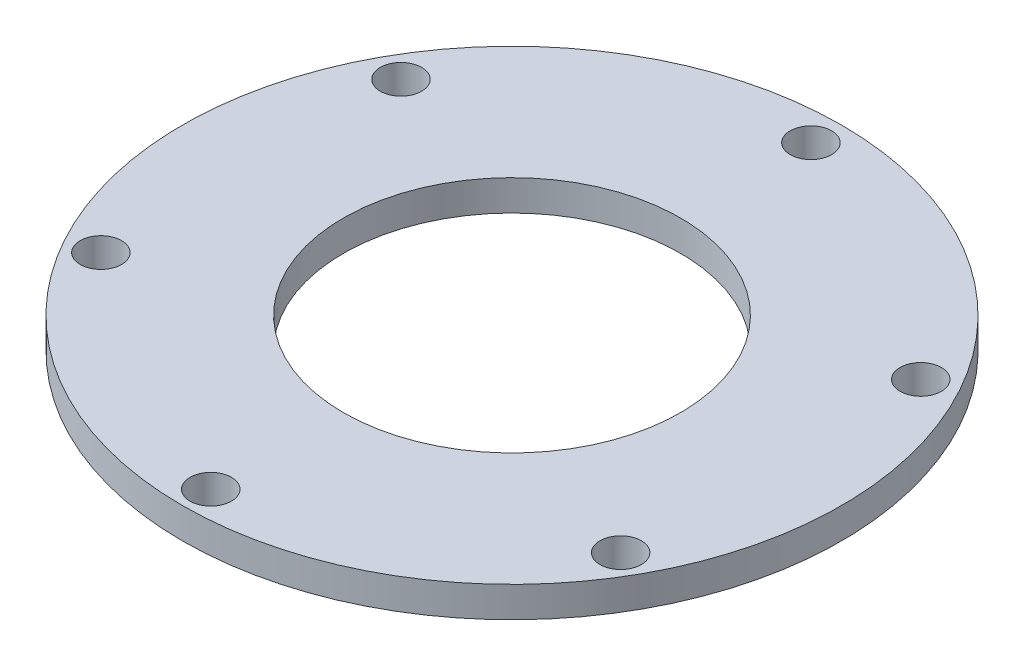
ISO-10303-21;
HEADER;
FILE_DESCRIPTION(('STEP AP214'),'2;1');
FILE_NAME('part.step','',(''),(''),'','','');
FILE_SCHEMA(('AUTOMOTIVE_DESIGN { 1 0 10303 214 1 1 1 1 }'));
ENDSEC;
DATA;
#1=APPLICATION_CONTEXT('core data for automotive mechanical design processes');
#2=APPLICATION_PROTOCOL_DEFINITION('international standard','automotive_design',2000,#1);
#3=PRODUCT_CONTEXT('',#1,'mechanical');
#4=PRODUCT('Part','Part','',(#3));
#5=PRODUCT_RELATED_PRODUCT_CATEGORY('part','',(#4));
#6=PRODUCT_DEFINITION_FORMATION('','',#4);
#7=PRODUCT_DEFINITION_CONTEXT('part definition',#1,'design');
#8=PRODUCT_DEFINITION('design','',#6,#7);
#9=PRODUCT_DEFINITION_SHAPE('','',#8);
#10=(LENGTH_UNIT() NAMED_UNIT(*) SI_UNIT(.MILLI.,.METRE.));
#11=(NAMED_UNIT(*) PLANE_ANGLE_UNIT() SI_UNIT($,.RADIAN.));
#12=(NAMED_UNIT(*) SI_UNIT($,.STERADIAN.) SOLID_ANGLE_UNIT());
#13=UNCERTAINTY_MEASURE_WITH_UNIT(LENGTH_MEASURE(1.E-05),#10,'distance_accuracy_value','');
#14=(GEOMETRIC_REPRESENTATION_CONTEXT(3) GLOBAL_UNCERTAINTY_ASSIGNED_CONTEXT((#13)) GLOBAL_UNIT_ASSIGNED_CONTEXT((#10,
#11,#12)) REPRESENTATION_CONTEXT('',''));
#15=CARTESIAN_POINT('',(0.,0.,0.));
#16=DIRECTION('',(0.,0.,1.));
#17=DIRECTION('',(1.,0.,0.));
#18=AXIS2_PLACEMENT_3D('',#15,#16,#17);
#19=CARTESIAN_POINT('',(0.,10.,0.));
#20=DIRECTION('',(0.,-1.,0.));
#21=DIRECTION('',(0.,0.,-1.));
#22=AXIS2_PLACEMENT_3D('',#19,#20,#21);
#23=CYLINDRICAL_SURFACE('',#22,107.5);
#24=CARTESIAN_POINT('',(0.,10.,0.));
#25=DIRECTION('',(0.,1.,0.));
#26=DIRECTION('',(0.,0.,1.));
#27=AXIS2_PLACEMENT_3D('',#24,#25,#26);
#28=CIRCLE('',#27,107.5);
#29=CARTESIAN_POINT('',(0.,10.,107.5));
#30=VERTEX_POINT('',#29);
#31=EDGE_CURVE('E10',#30,#30,#28,.T.);
#32=ORIENTED_EDGE('',*,*,#31,.F.);
#33=EDGE_LOOP('',(#32));
#34=FACE_BOUND('',#33,.T.);
#35=CARTESIAN_POINT('',(0.,0.,0.));
#36=DIRECTION('',(0.,1.,0.));
#37=DIRECTION('',(0.,0.,1.));
#38=AXIS2_PLACEMENT_3D('',#35,#36,#37);
#39=CIRCLE('',#38,107.5);
#40=CARTESIAN_POINT('',(0.,0.,107.5));
#41=VERTEX_POINT('',#40);
#42=EDGE_CURVE('E38',#41,#41,#39,.T.);
#43=ORIENTED_EDGE('',*,*,#42,.T.);
#44=EDGE_LOOP('',(#43));
#45=FACE_BOUND('',#44,.T.);
#46=ADVANCED_FACE('F31',(#34,#45),#23,.T.);
#47=CARTESIAN_POINT('',(0.,10.,0.));
#48=DIRECTION('',(0.,1.,0.));
#49=DIRECTION('',(0.,0.,1.));
#50=AXIS2_PLACEMENT_3D('',#47,#48,#49);
#51=PLANE('',#50);
#52=CARTESIAN_POINT('',(0.,10.,0.));
#53=DIRECTION('',(0.,1.,0.));
#54=DIRECTION('',(0.,0.,1.));
#55=AXIS2_PLACEMENT_3D('',#52,#53,#54);
#56=CIRCLE('',#55,55.);
#57=CARTESIAN_POINT('',(0.,10.,55.));
#58=VERTEX_POINT('',#57);
#59=EDGE_CURVE('E84',#58,#58,#56,.T.);
#60=ORIENTED_EDGE('',*,*,#59,.F.);
#61=EDGE_LOOP('',(#60));
#62=FACE_BOUND('',#61,.T.);
#63=CARTESIAN_POINT('',(84.7717038680075,10.,-48.5570339521433));
#64=DIRECTION('',(0.,1.,0.));
#65=DIRECTION('',(0.,0.,1.));
#66=AXIS2_PLACEMENT_3D('',#63,#64,#65);
#67=CIRCLE('',#66,6.74999999999999);
#68=CARTESIAN_POINT('',(84.7717038680075,10.,-41.8070339521433));
#69=VERTEX_POINT('',#68);
#70=EDGE_CURVE('E80',#69,#69,#67,.T.);
#71=ORIENTED_EDGE('',*,*,#70,.F.);
#72=EDGE_LOOP('',(#71));
#73=FACE_BOUND('',#72,.T.);
#74=CARTESIAN_POINT('',(84.7717038680085,10.,49.3288981435723));
#75=DIRECTION('',(0.,1.,0.));
#76=DIRECTION('',(0.,0.,1.));
#77=AXIS2_PLACEMENT_3D('',#74,#75,#76);
#78=CIRCLE('',#77,6.74999999999999);
#79=CARTESIAN_POINT('',(84.7717038680085,10.,56.0788981435723));
#80=VERTEX_POINT('',#79);
#81=EDGE_CURVE('E74',#80,#80,#78,.T.);
#82=ORIENTED_EDGE('',*,*,#81,.F.);
#83=EDGE_LOOP('',(#82));
#84=FACE_BOUND('',#83,.T.);
#85=CARTESIAN_POINT('',(0.,10.,98.2718641914308));
#86=DIRECTION('',(0.,1.,0.));
#87=DIRECTION('',(0.,0.,1.));
#88=AXIS2_PLACEMENT_3D('',#85,#86,#87);
#89=CIRCLE('',#88,6.74999999999999);
#90=CARTESIAN_POINT('',(0.,10.,105.021864191431));
#91=VERTEX_POINT('',#90);
#92=EDGE_CURVE('E71',#91,#91,#89,.T.);
#93=ORIENTED_EDGE('',*,*,#92,.F.);
#94=EDGE_LOOP('',(#93));
#95=FACE_BOUND('',#94,.T.);
#96=CARTESIAN_POINT('',(-84.7717038680079,10.,49.3288981435735));
#97=DIRECTION('',(0.,1.,0.));
#98=DIRECTION('',(0.,0.,1.));
#99=AXIS2_PLACEMENT_3D('',#96,#97,#98);
#100=CIRCLE('',#99,6.74999999999999);
#101=CARTESIAN_POINT('',(-84.7717038680079,10.,56.0788981435735));
#102=VERTEX_POINT('',#101);
#103=EDGE_CURVE('E65',#102,#102,#100,.T.);
#104=ORIENTED_EDGE('',*,*,#103,.F.);
#105=EDGE_LOOP('',(#104));
#106=FACE_BOUND('',#105,.T.);
#107=CARTESIAN_POINT('',(-84.7717038680082,10.,-48.5570339521421));
#108=DIRECTION('',(0.,1.,0.));
#109=DIRECTION('',(0.,0.,1.));
#110=AXIS2_PLACEMENT_3D('',#107,#108,#109);
#111=CIRCLE('',#110,6.74999999999999);
#112=CARTESIAN_POINT('',(-84.7717038680082,10.,-41.8070339521421));
#113=VERTEX_POINT('',#112);
#114=EDGE_CURVE('E56',#113,#113,#111,.T.);
#115=ORIENTED_EDGE('',*,*,#114,.F.);
#116=EDGE_LOOP('',(#115));
#117=FACE_BOUND('',#116,.T.);
#118=CARTESIAN_POINT('',(0.,10.,-97.5));
#119=DIRECTION('',(0.,1.,0.));
#120=DIRECTION('',(0.,0.,1.));
#121=AXIS2_PLACEMENT_3D('',#118,#119,#120);
#122=CIRCLE('',#121,6.74999999999999);
#123=CARTESIAN_POINT('',(0.,10.,-90.75));
#124=VERTEX_POINT('',#123);
#125=EDGE_CURVE('E46',#124,#124,#122,.T.);
#126=ORIENTED_EDGE('',*,*,#125,.F.);
#127=EDGE_LOOP('',(#126));
#128=FACE_BOUND('',#127,.T.);
#129=ORIENTED_EDGE('',*,*,#31,.T.);
#130=EDGE_LOOP('',(#129));
#131=FACE_BOUND('',#130,.T.);
#132=ADVANCED_FACE('F100',(#62,#73,#84,#95,#106,#117,#128,#131),#51,.T.);
#133=CARTESIAN_POINT('',(0.,0.,0.));
#134=DIRECTION('',(0.,1.,0.));
#135=DIRECTION('',(0.,0.,1.));
#136=AXIS2_PLACEMENT_3D('',#133,#134,#135);
#137=PLANE('',#136);
#138=CARTESIAN_POINT('',(0.,0.,0.));
#139=DIRECTION('',(0.,1.,0.));
#140=DIRECTION('',(0.,0.,1.));
#141=AXIS2_PLACEMENT_3D('',#138,#139,#140);
#142=CIRCLE('',#141,55.);
#143=CARTESIAN_POINT('',(0.,0.,55.));
#144=VERTEX_POINT('',#143);
#145=EDGE_CURVE('E83',#144,#144,#142,.T.);
#146=ORIENTED_EDGE('',*,*,#145,.T.);
#147=EDGE_LOOP('',(#146));
#148=FACE_BOUND('',#147,.T.);
#149=CARTESIAN_POINT('',(84.7717038680075,0.,-48.5570339521433));
#150=DIRECTION('',(0.,1.,0.));
#151=DIRECTION('',(0.,0.,1.));
#152=AXIS2_PLACEMENT_3D('',#149,#150,#151);
#153=CIRCLE('',#152,6.74999999999998);
#154=CARTESIAN_POINT('',(84.7717038680075,0.,-41.8070339521433));
#155=VERTEX_POINT('',#154);
#156=EDGE_CURVE('E77',#155,#155,#153,.T.);
#157=ORIENTED_EDGE('',*,*,#156,.T.);
#158=EDGE_LOOP('',(#157));
#159=FACE_BOUND('',#158,.T.);
#160=CARTESIAN_POINT('',(84.7717038680085,0.,49.3288981435723));
#161=DIRECTION('',(0.,1.,0.));
#162=DIRECTION('',(0.,0.,1.));
#163=AXIS2_PLACEMENT_3D('',#160,#161,#162);
#164=CIRCLE('',#163,6.74999999999998);
#165=CARTESIAN_POINT('',(84.7717038680085,0.,56.0788981435723));
#166=VERTEX_POINT('',#165);
#167=EDGE_CURVE('E34',#166,#166,#164,.T.);
#168=ORIENTED_EDGE('',*,*,#167,.T.);
#169=EDGE_LOOP('',(#168));
#170=FACE_BOUND('',#169,.T.);
#171=CARTESIAN_POINT('',(0.,0.,98.2718641914308));
#172=DIRECTION('',(0.,1.,0.));
#173=DIRECTION('',(0.,0.,1.));
#174=AXIS2_PLACEMENT_3D('',#171,#172,#173);
#175=CIRCLE('',#174,6.74999999999998);
#176=CARTESIAN_POINT('',(0.,0.,105.021864191431));
#177=VERTEX_POINT('',#176);
#178=EDGE_CURVE('E68',#177,#177,#175,.T.);
#179=ORIENTED_EDGE('',*,*,#178,.T.);
#180=EDGE_LOOP('',(#179));
#181=FACE_BOUND('',#180,.T.);
#182=CARTESIAN_POINT('',(-84.7717038680079,0.,49.3288981435735));
#183=DIRECTION('',(0.,1.,0.));
#184=DIRECTION('',(0.,0.,1.));
#185=AXIS2_PLACEMENT_3D('',#182,#183,#184);
#186=CIRCLE('',#185,6.74999999999998);
#187=CARTESIAN_POINT('',(-84.7717038680079,0.,56.0788981435735));
#188=VERTEX_POINT('',#187);
#189=EDGE_CURVE('E60',#188,#188,#186,.T.);
#190=ORIENTED_EDGE('',*,*,#189,.T.);
#191=EDGE_LOOP('',(#190));
#192=FACE_BOUND('',#191,.T.);
#193=CARTESIAN_POINT('',(-84.7717038680082,0.,-48.5570339521421));
#194=DIRECTION('',(0.,1.,0.));
#195=DIRECTION('',(0.,0.,1.));
#196=AXIS2_PLACEMENT_3D('',#193,#194,#195);
#197=CIRCLE('',#196,6.74999999999998);
#198=CARTESIAN_POINT('',(-84.7717038680082,0.,-41.8070339521421));
#199=VERTEX_POINT('',#198);
#200=EDGE_CURVE('E52',#199,#199,#197,.T.);
#201=ORIENTED_EDGE('',*,*,#200,.T.);
#202=EDGE_LOOP('',(#201));
#203=FACE_BOUND('',#202,.T.);
#204=CARTESIAN_POINT('',(0.,0.,-97.5));
#205=DIRECTION('',(0.,1.,0.));
#206=DIRECTION('',(0.,0.,1.));
#207=AXIS2_PLACEMENT_3D('',#204,#205,#206);
#208=CIRCLE('',#207,6.74999999999998);
#209=CARTESIAN_POINT('',(0.,0.,-90.75));
#210=VERTEX_POINT('',#209);
#211=EDGE_CURVE('E43',#210,#210,#208,.T.);
#212=ORIENTED_EDGE('',*,*,#211,.T.);
#213=EDGE_LOOP('',(#212));
#214=FACE_BOUND('',#213,.T.);
#215=ORIENTED_EDGE('',*,*,#42,.F.);
#216=EDGE_LOOP('',(#215));
#217=FACE_BOUND('',#216,.T.);
#218=ADVANCED_FACE('F90',(#148,#159,#170,#181,#192,#203,#214,#217),#137,.F.);
#219=CARTESIAN_POINT('',(0.,10.,-97.5));
#220=DIRECTION('',(0.,1.,0.));
#221=DIRECTION('',(0.,0.,1.));
#222=AXIS2_PLACEMENT_3D('',#219,#220,#221);
#223=CYLINDRICAL_SURFACE('',#222,6.74999999999998);
#224=ORIENTED_EDGE('',*,*,#125,.T.);
#225=EDGE_LOOP('',(#224));
#226=FACE_BOUND('',#225,.T.);
#227=ORIENTED_EDGE('',*,*,#211,.F.);
#228=EDGE_LOOP('',(#227));
#229=FACE_BOUND('',#228,.T.);
#230=ADVANCED_FACE('F119',(#226,#229),#223,.F.);
#231=CARTESIAN_POINT('',(-84.7717038680082,10.,-48.5570339521421));
#232=DIRECTION('',(0.,1.,0.));
#233=DIRECTION('',(0.,0.,1.));
#234=AXIS2_PLACEMENT_3D('',#231,#232,#233);
#235=CYLINDRICAL_SURFACE('',#234,6.74999999999998);
#236=ORIENTED_EDGE('',*,*,#114,.T.);
#237=EDGE_LOOP('',(#236));
#238=FACE_BOUND('',#237,.T.);
#239=ORIENTED_EDGE('',*,*,#200,.F.);
#240=EDGE_LOOP('',(#239));
#241=FACE_BOUND('',#240,.T.);
#242=ADVANCED_FACE('F115',(#238,#241),#235,.F.);
#243=CARTESIAN_POINT('',(-84.7717038680079,10.,49.3288981435735));
#244=DIRECTION('',(0.,1.,0.));
#245=DIRECTION('',(0.,0.,1.));
#246=AXIS2_PLACEMENT_3D('',#243,#244,#245);
#247=CYLINDRICAL_SURFACE('',#246,6.74999999999998);
#248=ORIENTED_EDGE('',*,*,#103,.T.);
#249=EDGE_LOOP('',(#248));
#250=FACE_BOUND('',#249,.T.);
#251=ORIENTED_EDGE('',*,*,#189,.F.);
#252=EDGE_LOOP('',(#251));
#253=FACE_BOUND('',#252,.T.);
#254=ADVANCED_FACE('F118',(#250,#253),#247,.F.);
#255=CARTESIAN_POINT('',(0.,10.,98.2718641914308));
#256=DIRECTION('',(0.,1.,0.));
#257=DIRECTION('',(0.,0.,1.));
#258=AXIS2_PLACEMENT_3D('',#255,#256,#257);
#259=CYLINDRICAL_SURFACE('',#258,6.74999999999998);
#260=ORIENTED_EDGE('',*,*,#92,.T.);
#261=EDGE_LOOP('',(#260));
#262=FACE_BOUND('',#261,.T.);
#263=ORIENTED_EDGE('',*,*,#178,.F.);
#264=EDGE_LOOP('',(#263));
#265=FACE_BOUND('',#264,.T.);
#266=ADVANCED_FACE('F125',(#262,#265),#259,.F.);
#267=CARTESIAN_POINT('',(84.7717038680085,10.,49.3288981435723));
#268=DIRECTION('',(0.,1.,0.));
#269=DIRECTION('',(0.,0.,1.));
#270=AXIS2_PLACEMENT_3D('',#267,#268,#269);
#271=CYLINDRICAL_SURFACE('',#270,6.74999999999998);
#272=ORIENTED_EDGE('',*,*,#81,.T.);
#273=EDGE_LOOP('',(#272));
#274=FACE_BOUND('',#273,.T.);
#275=ORIENTED_EDGE('',*,*,#167,.F.);
#276=EDGE_LOOP('',(#275));
#277=FACE_BOUND('',#276,.T.);
#278=ADVANCED_FACE('F167',(#274,#277),#271,.F.);
#279=CARTESIAN_POINT('',(84.7717038680075,10.,-48.5570339521433));
#280=DIRECTION('',(0.,1.,0.));
#281=DIRECTION('',(0.,0.,1.));
#282=AXIS2_PLACEMENT_3D('',#279,#280,#281);
#283=CYLINDRICAL_SURFACE('',#282,6.74999999999998);
#284=ORIENTED_EDGE('',*,*,#70,.T.);
#285=EDGE_LOOP('',(#284));
#286=FACE_BOUND('',#285,.T.);
#287=ORIENTED_EDGE('',*,*,#156,.F.);
#288=EDGE_LOOP('',(#287));
#289=FACE_BOUND('',#288,.T.);
#290=ADVANCED_FACE('F96',(#286,#289),#283,.F.);
#291=CARTESIAN_POINT('',(0.,0.,0.));
#292=DIRECTION('',(0.,1.,0.));
#293=DIRECTION('',(0.,0.,1.));
#294=AXIS2_PLACEMENT_3D('',#291,#292,#293);
#295=CYLINDRICAL_SURFACE('',#294,55.);
#296=ORIENTED_EDGE('',*,*,#145,.F.);
#297=EDGE_LOOP('',(#296));
#298=FACE_BOUND('',#297,.T.);
#299=ORIENTED_EDGE('',*,*,#59,.T.);
#300=EDGE_LOOP('',(#299));
#301=FACE_BOUND('',#300,.T.);
#302=ADVANCED_FACE('F93',(#298,#301),#295,.F.);
#303=CLOSED_SHELL('',(#46,#132,#218,#230,#242,#254,#266,#278,#290,#302));
#304=MANIFOLD_SOLID_BREP('B2',#303);
#305=ADVANCED_BREP_SHAPE_REPRESENTATION('',(#18,#304),#14);
#306=SHAPE_DEFINITION_REPRESENTATION(#9,#305);
ENDSEC;
END-ISO-10303-21;
